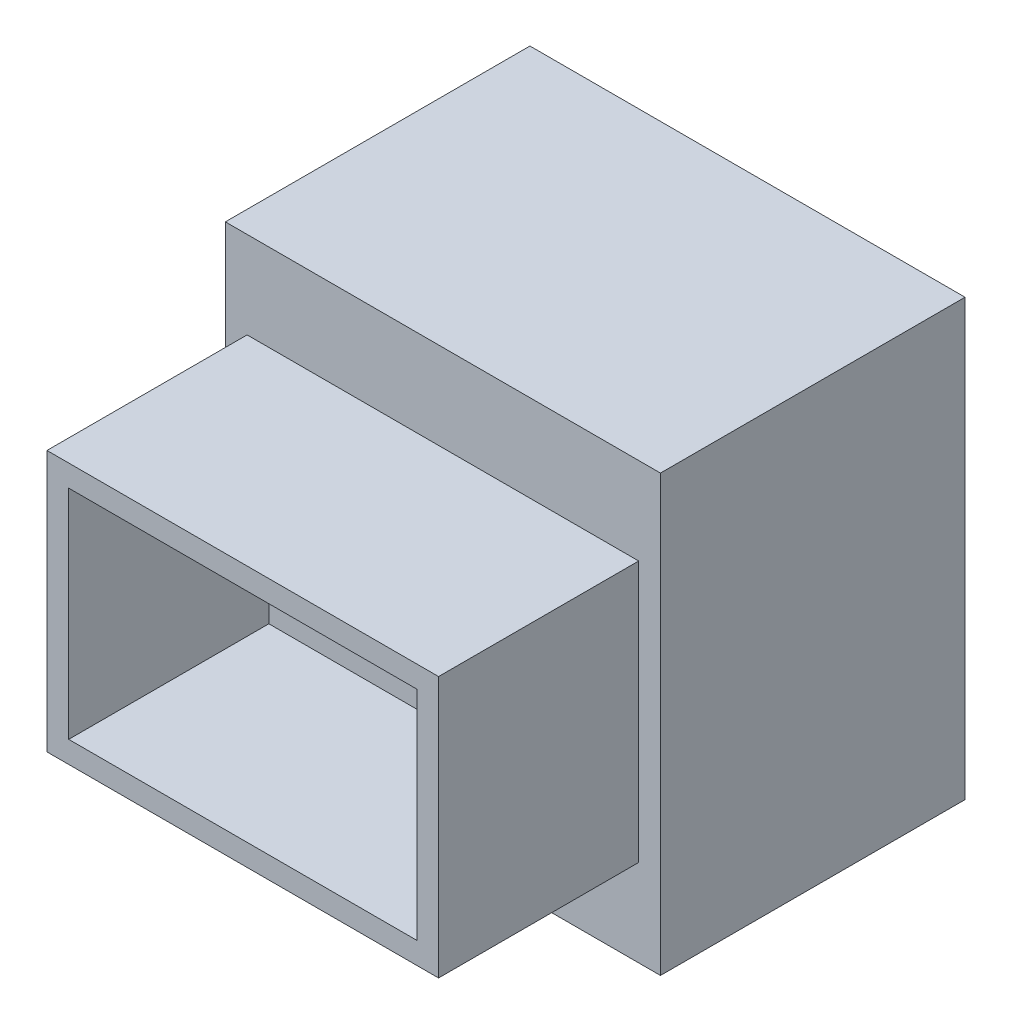
ISO-10303-21;
HEADER;
FILE_DESCRIPTION(('STEP AP214'),'2;1');
FILE_NAME('part.step','',(''),(''),'','','');
FILE_SCHEMA(('AUTOMOTIVE_DESIGN { 1 0 10303 214 1 1 1 1 }'));
ENDSEC;
DATA;
#1=APPLICATION_CONTEXT('core data for automotive mechanical design processes');
#2=APPLICATION_PROTOCOL_DEFINITION('international standard','automotive_design',2000,#1);
#3=PRODUCT_CONTEXT('',#1,'mechanical');
#4=PRODUCT('Part','Part','',(#3));
#5=PRODUCT_RELATED_PRODUCT_CATEGORY('part','',(#4));
#6=PRODUCT_DEFINITION_FORMATION('','',#4);
#7=PRODUCT_DEFINITION_CONTEXT('part definition',#1,'design');
#8=PRODUCT_DEFINITION('design','',#6,#7);
#9=PRODUCT_DEFINITION_SHAPE('','',#8);
#10=(LENGTH_UNIT() NAMED_UNIT(*) SI_UNIT(.MILLI.,.METRE.));
#11=(NAMED_UNIT(*) PLANE_ANGLE_UNIT() SI_UNIT($,.RADIAN.));
#12=(NAMED_UNIT(*) SI_UNIT($,.STERADIAN.) SOLID_ANGLE_UNIT());
#13=UNCERTAINTY_MEASURE_WITH_UNIT(LENGTH_MEASURE(1.E-05),#10,'distance_accuracy_value','');
#14=(GEOMETRIC_REPRESENTATION_CONTEXT(3) GLOBAL_UNCERTAINTY_ASSIGNED_CONTEXT((#13)) GLOBAL_UNIT_ASSIGNED_CONTEXT((#10,
#11,#12)) REPRESENTATION_CONTEXT('',''));
#15=CARTESIAN_POINT('',(0.,0.,0.));
#16=DIRECTION('',(0.,0.,1.));
#17=DIRECTION('',(1.,0.,0.));
#18=AXIS2_PLACEMENT_3D('',#15,#16,#17);
#19=CARTESIAN_POINT('',(0.,0.,70.));
#20=DIRECTION('',(0.,0.,-1.));
#21=DIRECTION('',(-1.,0.,0.));
#22=AXIS2_PLACEMENT_3D('',#19,#20,#21);
#23=PLANE('',#22);
#24=DIRECTION('',(0.,-1.,0.));
#25=VECTOR('',#24,1.);
#26=CARTESIAN_POINT('',(-50.,50.,70.));
#27=LINE('',#26,#25);
#28=CARTESIAN_POINT('',(-50.,50.,70.));
#29=VERTEX_POINT('',#28);
#30=CARTESIAN_POINT('',(-50.,-50.,70.));
#31=VERTEX_POINT('',#30);
#32=EDGE_CURVE('E191',#29,#31,#27,.T.);
#33=ORIENTED_EDGE('',*,*,#32,.T.);
#34=DIRECTION('',(1.,0.,0.));
#35=VECTOR('',#34,1.);
#36=CARTESIAN_POINT('',(50.,-50.,70.));
#37=LINE('',#36,#35);
#38=CARTESIAN_POINT('',(50.,-50.,70.));
#39=VERTEX_POINT('',#38);
#40=EDGE_CURVE('E194',#31,#39,#37,.T.);
#41=ORIENTED_EDGE('',*,*,#40,.T.);
#42=DIRECTION('',(0.,1.,0.));
#43=VECTOR('',#42,1.);
#44=CARTESIAN_POINT('',(50.,50.,70.));
#45=LINE('',#44,#43);
#46=CARTESIAN_POINT('',(50.,50.,70.));
#47=VERTEX_POINT('',#46);
#48=EDGE_CURVE('E197',#39,#47,#45,.T.);
#49=ORIENTED_EDGE('',*,*,#48,.T.);
#50=DIRECTION('',(-1.,0.,0.));
#51=VECTOR('',#50,1.);
#52=CARTESIAN_POINT('',(50.,50.,70.));
#53=LINE('',#52,#51);
#54=EDGE_CURVE('E199',#47,#29,#53,.T.);
#55=ORIENTED_EDGE('',*,*,#54,.T.);
#56=EDGE_LOOP('',(#33,#41,#49,#55));
#57=FACE_BOUND('',#56,.T.);
#58=DIRECTION('',(0.,-1.,0.));
#59=VECTOR('',#58,1.);
#60=CARTESIAN_POINT('',(-45.,30.,70.));
#61=LINE('',#60,#59);
#62=CARTESIAN_POINT('',(-45.,30.,70.));
#63=VERTEX_POINT('',#62);
#64=CARTESIAN_POINT('',(-45.,-30.,70.));
#65=VERTEX_POINT('',#64);
#66=EDGE_CURVE('E139',#63,#65,#61,.T.);
#67=ORIENTED_EDGE('',*,*,#66,.F.);
#68=DIRECTION('',(-1.,0.,0.));
#69=VECTOR('',#68,1.);
#70=CARTESIAN_POINT('',(45.,30.,70.));
#71=LINE('',#70,#69);
#72=CARTESIAN_POINT('',(45.,30.,70.));
#73=VERTEX_POINT('',#72);
#74=EDGE_CURVE('E167',#73,#63,#71,.T.);
#75=ORIENTED_EDGE('',*,*,#74,.F.);
#76=DIRECTION('',(0.,1.,0.));
#77=VECTOR('',#76,1.);
#78=CARTESIAN_POINT('',(45.,30.,70.));
#79=LINE('',#78,#77);
#80=CARTESIAN_POINT('',(45.,-30.,70.));
#81=VERTEX_POINT('',#80);
#82=EDGE_CURVE('E53',#81,#73,#79,.T.);
#83=ORIENTED_EDGE('',*,*,#82,.F.);
#84=DIRECTION('',(1.,0.,0.));
#85=VECTOR('',#84,1.);
#86=CARTESIAN_POINT('',(45.,-30.,70.));
#87=LINE('',#86,#85);
#88=EDGE_CURVE('E48',#65,#81,#87,.T.);
#89=ORIENTED_EDGE('',*,*,#88,.F.);
#90=EDGE_LOOP('',(#67,#75,#83,#89));
#91=FACE_BOUND('',#90,.T.);
#92=ADVANCED_FACE('F33',(#57,#91),#23,.F.);
#93=CARTESIAN_POINT('',(-50.,50.,70.));
#94=DIRECTION('',(1.,0.,0.));
#95=DIRECTION('',(0.,1.,0.));
#96=AXIS2_PLACEMENT_3D('',#93,#94,#95);
#97=PLANE('',#96);
#98=DIRECTION('',(0.,-1.,0.));
#99=VECTOR('',#98,1.);
#100=CARTESIAN_POINT('',(-50.,50.,0.));
#101=LINE('',#100,#99);
#102=CARTESIAN_POINT('',(-50.,50.,0.));
#103=VERTEX_POINT('',#102);
#104=CARTESIAN_POINT('',(-50.,-50.,0.));
#105=VERTEX_POINT('',#104);
#106=EDGE_CURVE('E190',#103,#105,#101,.T.);
#107=ORIENTED_EDGE('',*,*,#106,.T.);
#108=DIRECTION('',(0.,0.,-1.));
#109=VECTOR('',#108,1.);
#110=CARTESIAN_POINT('',(-50.,-50.,70.));
#111=LINE('',#110,#109);
#112=EDGE_CURVE('E11',#31,#105,#111,.T.);
#113=ORIENTED_EDGE('',*,*,#112,.F.);
#114=ORIENTED_EDGE('',*,*,#32,.F.);
#115=DIRECTION('',(0.,0.,-1.));
#116=VECTOR('',#115,1.);
#117=CARTESIAN_POINT('',(-50.,50.,70.));
#118=LINE('',#117,#116);
#119=EDGE_CURVE('E201',#29,#103,#118,.T.);
#120=ORIENTED_EDGE('',*,*,#119,.T.);
#121=EDGE_LOOP('',(#107,#113,#114,#120));
#122=FACE_BOUND('',#121,.T.);
#123=ADVANCED_FACE('F35',(#122),#97,.F.);
#124=CARTESIAN_POINT('',(50.,-50.,70.));
#125=DIRECTION('',(0.,1.,0.));
#126=DIRECTION('',(-1.,0.,0.));
#127=AXIS2_PLACEMENT_3D('',#124,#125,#126);
#128=PLANE('',#127);
#129=DIRECTION('',(1.,0.,0.));
#130=VECTOR('',#129,1.);
#131=CARTESIAN_POINT('',(50.,-50.,0.));
#132=LINE('',#131,#130);
#133=CARTESIAN_POINT('',(50.,-50.,0.));
#134=VERTEX_POINT('',#133);
#135=EDGE_CURVE('E204',#105,#134,#132,.T.);
#136=ORIENTED_EDGE('',*,*,#135,.T.);
#137=DIRECTION('',(0.,0.,-1.));
#138=VECTOR('',#137,1.);
#139=CARTESIAN_POINT('',(50.,-50.,70.));
#140=LINE('',#139,#138);
#141=EDGE_CURVE('E41',#39,#134,#140,.T.);
#142=ORIENTED_EDGE('',*,*,#141,.F.);
#143=ORIENTED_EDGE('',*,*,#40,.F.);
#144=ORIENTED_EDGE('',*,*,#112,.T.);
#145=EDGE_LOOP('',(#136,#142,#143,#144));
#146=FACE_BOUND('',#145,.T.);
#147=ADVANCED_FACE('F233',(#146),#128,.F.);
#148=CARTESIAN_POINT('',(50.,50.,70.));
#149=DIRECTION('',(-1.,0.,0.));
#150=DIRECTION('',(0.,-1.,0.));
#151=AXIS2_PLACEMENT_3D('',#148,#149,#150);
#152=PLANE('',#151);
#153=DIRECTION('',(0.,1.,0.));
#154=VECTOR('',#153,1.);
#155=CARTESIAN_POINT('',(50.,50.,0.));
#156=LINE('',#155,#154);
#157=CARTESIAN_POINT('',(50.,50.,0.));
#158=VERTEX_POINT('',#157);
#159=EDGE_CURVE('E206',#134,#158,#156,.T.);
#160=ORIENTED_EDGE('',*,*,#159,.T.);
#161=DIRECTION('',(0.,0.,-1.));
#162=VECTOR('',#161,1.);
#163=CARTESIAN_POINT('',(50.,50.,70.));
#164=LINE('',#163,#162);
#165=EDGE_CURVE('E211',#47,#158,#164,.T.);
#166=ORIENTED_EDGE('',*,*,#165,.F.);
#167=ORIENTED_EDGE('',*,*,#48,.F.);
#168=ORIENTED_EDGE('',*,*,#141,.T.);
#169=EDGE_LOOP('',(#160,#166,#167,#168));
#170=FACE_BOUND('',#169,.T.);
#171=ADVANCED_FACE('F218',(#170),#152,.F.);
#172=CARTESIAN_POINT('',(50.,50.,70.));
#173=DIRECTION('',(0.,-1.,0.));
#174=DIRECTION('',(1.,0.,0.));
#175=AXIS2_PLACEMENT_3D('',#172,#173,#174);
#176=PLANE('',#175);
#177=DIRECTION('',(-1.,0.,0.));
#178=VECTOR('',#177,1.);
#179=CARTESIAN_POINT('',(50.,50.,0.));
#180=LINE('',#179,#178);
#181=EDGE_CURVE('E195',#158,#103,#180,.T.);
#182=ORIENTED_EDGE('',*,*,#181,.T.);
#183=ORIENTED_EDGE('',*,*,#119,.F.);
#184=ORIENTED_EDGE('',*,*,#54,.F.);
#185=ORIENTED_EDGE('',*,*,#165,.T.);
#186=EDGE_LOOP('',(#182,#183,#184,#185));
#187=FACE_BOUND('',#186,.T.);
#188=ADVANCED_FACE('F227',(#187),#176,.F.);
#189=CARTESIAN_POINT('',(0.,0.,0.));
#190=DIRECTION('',(0.,0.,-1.));
#191=DIRECTION('',(-1.,0.,0.));
#192=AXIS2_PLACEMENT_3D('',#189,#190,#191);
#193=PLANE('',#192);
#194=ORIENTED_EDGE('',*,*,#106,.F.);
#195=ORIENTED_EDGE('',*,*,#181,.F.);
#196=ORIENTED_EDGE('',*,*,#159,.F.);
#197=ORIENTED_EDGE('',*,*,#135,.F.);
#198=EDGE_LOOP('',(#194,#195,#196,#197));
#199=FACE_BOUND('',#198,.T.);
#200=ADVANCED_FACE('F224',(#199),#193,.T.);
#201=CARTESIAN_POINT('',(0.,0.,116.));
#202=DIRECTION('',(0.,0.,-1.));
#203=DIRECTION('',(-1.,0.,0.));
#204=AXIS2_PLACEMENT_3D('',#201,#202,#203);
#205=PLANE('',#204);
#206=DIRECTION('',(0.,-1.,0.));
#207=VECTOR('',#206,1.);
#208=CARTESIAN_POINT('',(-45.,30.,116.));
#209=LINE('',#208,#207);
#210=CARTESIAN_POINT('',(-45.,30.,116.));
#211=VERTEX_POINT('',#210);
#212=CARTESIAN_POINT('',(-45.,-30.,116.));
#213=VERTEX_POINT('',#212);
#214=EDGE_CURVE('E163',#211,#213,#209,.T.);
#215=ORIENTED_EDGE('',*,*,#214,.T.);
#216=DIRECTION('',(1.,0.,0.));
#217=VECTOR('',#216,1.);
#218=CARTESIAN_POINT('',(45.,-30.,116.));
#219=LINE('',#218,#217);
#220=CARTESIAN_POINT('',(45.,-30.,116.));
#221=VERTEX_POINT('',#220);
#222=EDGE_CURVE('E166',#213,#221,#219,.T.);
#223=ORIENTED_EDGE('',*,*,#222,.T.);
#224=DIRECTION('',(0.,1.,0.));
#225=VECTOR('',#224,1.);
#226=CARTESIAN_POINT('',(45.,30.,116.));
#227=LINE('',#226,#225);
#228=CARTESIAN_POINT('',(45.,30.,116.));
#229=VERTEX_POINT('',#228);
#230=EDGE_CURVE('E169',#221,#229,#227,.T.);
#231=ORIENTED_EDGE('',*,*,#230,.T.);
#232=DIRECTION('',(-1.,0.,0.));
#233=VECTOR('',#232,1.);
#234=CARTESIAN_POINT('',(45.,30.,116.));
#235=LINE('',#234,#233);
#236=EDGE_CURVE('E171',#229,#211,#235,.T.);
#237=ORIENTED_EDGE('',*,*,#236,.T.);
#238=EDGE_LOOP('',(#215,#223,#231,#237));
#239=FACE_BOUND('',#238,.T.);
#240=DIRECTION('',(0.,-1.,0.));
#241=VECTOR('',#240,1.);
#242=CARTESIAN_POINT('',(-40.,25.,116.));
#243=LINE('',#242,#241);
#244=CARTESIAN_POINT('',(-40.,25.,116.));
#245=VERTEX_POINT('',#244);
#246=CARTESIAN_POINT('',(-40.,-25.,116.));
#247=VERTEX_POINT('',#246);
#248=EDGE_CURVE('E121',#245,#247,#243,.T.);
#249=ORIENTED_EDGE('',*,*,#248,.F.);
#250=DIRECTION('',(-1.,0.,0.));
#251=VECTOR('',#250,1.);
#252=CARTESIAN_POINT('',(40.,25.,116.));
#253=LINE('',#252,#251);
#254=CARTESIAN_POINT('',(40.,25.,116.));
#255=VERTEX_POINT('',#254);
#256=EDGE_CURVE('E147',#255,#245,#253,.T.);
#257=ORIENTED_EDGE('',*,*,#256,.F.);
#258=DIRECTION('',(0.,1.,0.));
#259=VECTOR('',#258,1.);
#260=CARTESIAN_POINT('',(40.,25.,116.));
#261=LINE('',#260,#259);
#262=CARTESIAN_POINT('',(40.,-25.,116.));
#263=VERTEX_POINT('',#262);
#264=EDGE_CURVE('E145',#263,#255,#261,.T.);
#265=ORIENTED_EDGE('',*,*,#264,.F.);
#266=DIRECTION('',(1.,0.,0.));
#267=VECTOR('',#266,1.);
#268=CARTESIAN_POINT('',(40.,-25.,116.));
#269=LINE('',#268,#267);
#270=EDGE_CURVE('E131',#247,#263,#269,.T.);
#271=ORIENTED_EDGE('',*,*,#270,.F.);
#272=EDGE_LOOP('',(#249,#257,#265,#271));
#273=FACE_BOUND('',#272,.T.);
#274=ADVANCED_FACE('F143',(#239,#273),#205,.F.);
#275=CARTESIAN_POINT('',(-45.,30.,116.));
#276=DIRECTION('',(1.,0.,0.));
#277=DIRECTION('',(0.,0.,-1.));
#278=AXIS2_PLACEMENT_3D('',#275,#276,#277);
#279=PLANE('',#278);
#280=ORIENTED_EDGE('',*,*,#66,.T.);
#281=DIRECTION('',(0.,0.,-1.));
#282=VECTOR('',#281,1.);
#283=CARTESIAN_POINT('',(-45.,-30.,116.));
#284=LINE('',#283,#282);
#285=EDGE_CURVE('E188',#213,#65,#284,.T.);
#286=ORIENTED_EDGE('',*,*,#285,.F.);
#287=ORIENTED_EDGE('',*,*,#214,.F.);
#288=DIRECTION('',(0.,0.,-1.));
#289=VECTOR('',#288,1.);
#290=CARTESIAN_POINT('',(-45.,30.,116.));
#291=LINE('',#290,#289);
#292=EDGE_CURVE('E173',#211,#63,#291,.T.);
#293=ORIENTED_EDGE('',*,*,#292,.T.);
#294=EDGE_LOOP('',(#280,#286,#287,#293));
#295=FACE_BOUND('',#294,.T.);
#296=ADVANCED_FACE('F274',(#295),#279,.F.);
#297=CARTESIAN_POINT('',(45.,-30.,116.));
#298=DIRECTION('',(0.,1.,0.));
#299=DIRECTION('',(0.,0.,1.));
#300=AXIS2_PLACEMENT_3D('',#297,#298,#299);
#301=PLANE('',#300);
#302=ORIENTED_EDGE('',*,*,#88,.T.);
#303=DIRECTION('',(0.,0.,-1.));
#304=VECTOR('',#303,1.);
#305=CARTESIAN_POINT('',(45.,-30.,116.));
#306=LINE('',#305,#304);
#307=EDGE_CURVE('E185',#221,#81,#306,.T.);
#308=ORIENTED_EDGE('',*,*,#307,.F.);
#309=ORIENTED_EDGE('',*,*,#222,.F.);
#310=ORIENTED_EDGE('',*,*,#285,.T.);
#311=EDGE_LOOP('',(#302,#308,#309,#310));
#312=FACE_BOUND('',#311,.T.);
#313=ADVANCED_FACE('F282',(#312),#301,.F.);
#314=CARTESIAN_POINT('',(45.,30.,116.));
#315=DIRECTION('',(-1.,0.,0.));
#316=DIRECTION('',(0.,0.,1.));
#317=AXIS2_PLACEMENT_3D('',#314,#315,#316);
#318=PLANE('',#317);
#319=ORIENTED_EDGE('',*,*,#82,.T.);
#320=DIRECTION('',(0.,0.,-1.));
#321=VECTOR('',#320,1.);
#322=CARTESIAN_POINT('',(45.,30.,116.));
#323=LINE('',#322,#321);
#324=EDGE_CURVE('E182',#229,#73,#323,.T.);
#325=ORIENTED_EDGE('',*,*,#324,.F.);
#326=ORIENTED_EDGE('',*,*,#230,.F.);
#327=ORIENTED_EDGE('',*,*,#307,.T.);
#328=EDGE_LOOP('',(#319,#325,#326,#327));
#329=FACE_BOUND('',#328,.T.);
#330=ADVANCED_FACE('F278',(#329),#318,.F.);
#331=CARTESIAN_POINT('',(45.,30.,116.));
#332=DIRECTION('',(0.,-1.,0.));
#333=DIRECTION('',(0.,0.,-1.));
#334=AXIS2_PLACEMENT_3D('',#331,#332,#333);
#335=PLANE('',#334);
#336=ORIENTED_EDGE('',*,*,#74,.T.);
#337=ORIENTED_EDGE('',*,*,#292,.F.);
#338=ORIENTED_EDGE('',*,*,#236,.F.);
#339=ORIENTED_EDGE('',*,*,#324,.T.);
#340=EDGE_LOOP('',(#336,#337,#338,#339));
#341=FACE_BOUND('',#340,.T.);
#342=ADVANCED_FACE('F271',(#341),#335,.F.);
#343=CARTESIAN_POINT('',(-40.,25.,116.));
#344=DIRECTION('',(1.,0.,0.));
#345=DIRECTION('',(0.,0.,-1.));
#346=AXIS2_PLACEMENT_3D('',#343,#344,#345);
#347=PLANE('',#346);
#348=DIRECTION('',(0.,-1.,0.));
#349=VECTOR('',#348,1.);
#350=CARTESIAN_POINT('',(-40.,25.,70.));
#351=LINE('',#350,#349);
#352=CARTESIAN_POINT('',(-40.,25.,70.));
#353=VERTEX_POINT('',#352);
#354=CARTESIAN_POINT('',(-40.,-25.,70.));
#355=VERTEX_POINT('',#354);
#356=EDGE_CURVE('E151',#353,#355,#351,.T.);
#357=ORIENTED_EDGE('',*,*,#356,.F.);
#358=DIRECTION('',(0.,0.,-1.));
#359=VECTOR('',#358,1.);
#360=CARTESIAN_POINT('',(-40.,25.,116.));
#361=LINE('',#360,#359);
#362=EDGE_CURVE('E127',#245,#353,#361,.T.);
#363=ORIENTED_EDGE('',*,*,#362,.F.);
#364=ORIENTED_EDGE('',*,*,#248,.T.);
#365=DIRECTION('',(0.,0.,-1.));
#366=VECTOR('',#365,1.);
#367=CARTESIAN_POINT('',(-40.,-25.,116.));
#368=LINE('',#367,#366);
#369=EDGE_CURVE('E125',#247,#355,#368,.T.);
#370=ORIENTED_EDGE('',*,*,#369,.T.);
#371=EDGE_LOOP('',(#357,#363,#364,#370));
#372=FACE_BOUND('',#371,.T.);
#373=ADVANCED_FACE('F124',(#372),#347,.T.);
#374=CARTESIAN_POINT('',(40.,-25.,116.));
#375=DIRECTION('',(0.,1.,0.));
#376=DIRECTION('',(0.,0.,1.));
#377=AXIS2_PLACEMENT_3D('',#374,#375,#376);
#378=PLANE('',#377);
#379=DIRECTION('',(1.,0.,0.));
#380=VECTOR('',#379,1.);
#381=CARTESIAN_POINT('',(40.,-25.,70.));
#382=LINE('',#381,#380);
#383=CARTESIAN_POINT('',(40.,-25.,70.));
#384=VERTEX_POINT('',#383);
#385=EDGE_CURVE('E138',#355,#384,#382,.T.);
#386=ORIENTED_EDGE('',*,*,#385,.F.);
#387=ORIENTED_EDGE('',*,*,#369,.F.);
#388=ORIENTED_EDGE('',*,*,#270,.T.);
#389=DIRECTION('',(0.,0.,-1.));
#390=VECTOR('',#389,1.);
#391=CARTESIAN_POINT('',(40.,-25.,116.));
#392=LINE('',#391,#390);
#393=EDGE_CURVE('E140',#263,#384,#392,.T.);
#394=ORIENTED_EDGE('',*,*,#393,.T.);
#395=EDGE_LOOP('',(#386,#387,#388,#394));
#396=FACE_BOUND('',#395,.T.);
#397=ADVANCED_FACE('F135',(#396),#378,.T.);
#398=CARTESIAN_POINT('',(40.,25.,116.));
#399=DIRECTION('',(-1.,0.,0.));
#400=DIRECTION('',(0.,0.,1.));
#401=AXIS2_PLACEMENT_3D('',#398,#399,#400);
#402=PLANE('',#401);
#403=DIRECTION('',(0.,1.,0.));
#404=VECTOR('',#403,1.);
#405=CARTESIAN_POINT('',(40.,25.,70.));
#406=LINE('',#405,#404);
#407=CARTESIAN_POINT('',(40.,25.,70.));
#408=VERTEX_POINT('',#407);
#409=EDGE_CURVE('E154',#384,#408,#406,.T.);
#410=ORIENTED_EDGE('',*,*,#409,.F.);
#411=ORIENTED_EDGE('',*,*,#393,.F.);
#412=ORIENTED_EDGE('',*,*,#264,.T.);
#413=DIRECTION('',(0.,0.,-1.));
#414=VECTOR('',#413,1.);
#415=CARTESIAN_POINT('',(40.,25.,116.));
#416=LINE('',#415,#414);
#417=EDGE_CURVE('E160',#255,#408,#416,.T.);
#418=ORIENTED_EDGE('',*,*,#417,.T.);
#419=EDGE_LOOP('',(#410,#411,#412,#418));
#420=FACE_BOUND('',#419,.T.);
#421=ADVANCED_FACE('F256',(#420),#402,.T.);
#422=CARTESIAN_POINT('',(40.,25.,116.));
#423=DIRECTION('',(0.,-1.,0.));
#424=DIRECTION('',(0.,0.,-1.));
#425=AXIS2_PLACEMENT_3D('',#422,#423,#424);
#426=PLANE('',#425);
#427=DIRECTION('',(-1.,0.,0.));
#428=VECTOR('',#427,1.);
#429=CARTESIAN_POINT('',(40.,25.,70.));
#430=LINE('',#429,#428);
#431=EDGE_CURVE('E132',#408,#353,#430,.T.);
#432=ORIENTED_EDGE('',*,*,#431,.F.);
#433=ORIENTED_EDGE('',*,*,#417,.F.);
#434=ORIENTED_EDGE('',*,*,#256,.T.);
#435=ORIENTED_EDGE('',*,*,#362,.T.);
#436=EDGE_LOOP('',(#432,#433,#434,#435));
#437=FACE_BOUND('',#436,.T.);
#438=ADVANCED_FACE('F250',(#437),#426,.T.);
#439=ORIENTED_EDGE('',*,*,#431,.T.);
#440=ORIENTED_EDGE('',*,*,#356,.T.);
#441=ORIENTED_EDGE('',*,*,#385,.T.);
#442=ORIENTED_EDGE('',*,*,#409,.T.);
#443=EDGE_LOOP('',(#439,#440,#441,#442));
#444=FACE_BOUND('',#443,.T.);
#445=ADVANCED_FACE('F242',(#444),#23,.F.);
#446=CLOSED_SHELL('',(#92,#123,#147,#171,#188,#200,#274,#296,#313,#330,#342,#373,#397,#421,#438,#445));
#447=MANIFOLD_SOLID_BREP('B2',#446);
#448=ADVANCED_BREP_SHAPE_REPRESENTATION('',(#18,#447),#14);
#449=SHAPE_DEFINITION_REPRESENTATION(#9,#448);
ENDSEC;
END-ISO-10303-21;
